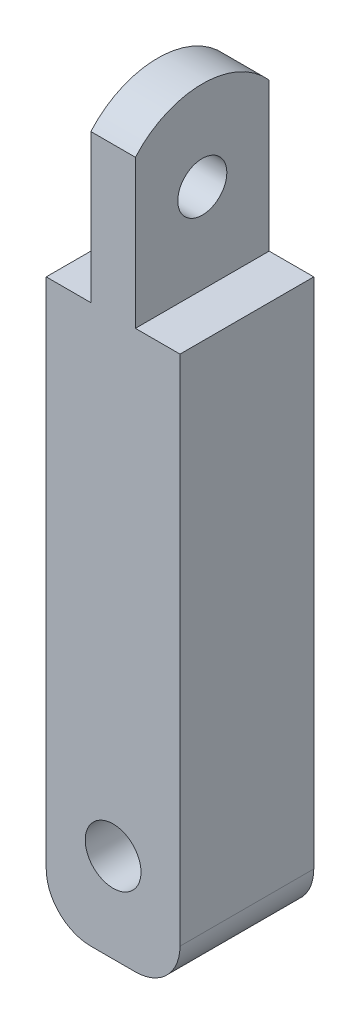
ISO-10303-21;
HEADER;
FILE_DESCRIPTION(('STEP AP214'),'2;1');
FILE_NAME('part.step','',(''),(''),'','','');
FILE_SCHEMA(('AUTOMOTIVE_DESIGN { 1 0 10303 214 1 1 1 1 }'));
ENDSEC;
DATA;
#1=APPLICATION_CONTEXT('core data for automotive mechanical design processes');
#2=APPLICATION_PROTOCOL_DEFINITION('international standard','automotive_design',2000,#1);
#3=PRODUCT_CONTEXT('',#1,'mechanical');
#4=PRODUCT('Part','Part','',(#3));
#5=PRODUCT_RELATED_PRODUCT_CATEGORY('part','',(#4));
#6=PRODUCT_DEFINITION_FORMATION('','',#4);
#7=PRODUCT_DEFINITION_CONTEXT('part definition',#1,'design');
#8=PRODUCT_DEFINITION('design','',#6,#7);
#9=PRODUCT_DEFINITION_SHAPE('','',#8);
#10=(LENGTH_UNIT() NAMED_UNIT(*) SI_UNIT(.MILLI.,.METRE.));
#11=(NAMED_UNIT(*) PLANE_ANGLE_UNIT() SI_UNIT($,.RADIAN.));
#12=(NAMED_UNIT(*) SI_UNIT($,.STERADIAN.) SOLID_ANGLE_UNIT());
#13=UNCERTAINTY_MEASURE_WITH_UNIT(LENGTH_MEASURE(1.E-05),#10,'distance_accuracy_value','');
#14=(GEOMETRIC_REPRESENTATION_CONTEXT(3) GLOBAL_UNCERTAINTY_ASSIGNED_CONTEXT((#13)) GLOBAL_UNIT_ASSIGNED_CONTEXT((#10,
#11,#12)) REPRESENTATION_CONTEXT('',''));
#15=CARTESIAN_POINT('',(0.,0.,0.));
#16=DIRECTION('',(0.,0.,1.));
#17=DIRECTION('',(1.,0.,0.));
#18=AXIS2_PLACEMENT_3D('',#15,#16,#17);
#19=CARTESIAN_POINT('',(1.,20.5,6.));
#20=DIRECTION('',(-1.,0.,0.));
#21=DIRECTION('',(0.,-1.,0.));
#22=AXIS2_PLACEMENT_3D('',#19,#20,#21);
#23=PLANE('',#22);
#24=CARTESIAN_POINT('',(1.,16.5,3.));
#25=DIRECTION('',(-1.,0.,0.));
#26=DIRECTION('',(0.,-1.,0.));
#27=AXIS2_PLACEMENT_3D('',#24,#25,#26);
#28=CIRCLE('',#27,1.1);
#29=CARTESIAN_POINT('',(1.,15.4,3.));
#30=VERTEX_POINT('',#29);
#31=EDGE_CURVE('E268',#30,#30,#28,.T.);
#32=ORIENTED_EDGE('',*,*,#31,.T.);
#33=EDGE_LOOP('',(#32));
#34=FACE_BOUND('',#33,.T.);
#35=DIRECTION('',(0.,1.,0.));
#36=VECTOR('',#35,1.);
#37=CARTESIAN_POINT('',(1.,20.5,0.));
#38=LINE('',#37,#36);
#39=CARTESIAN_POINT('',(1.,12.5,0.));
#40=VERTEX_POINT('',#39);
#41=CARTESIAN_POINT('',(1.,19.1457513110646,0.));
#42=VERTEX_POINT('',#41);
#43=EDGE_CURVE('E175',#40,#42,#38,.T.);
#44=ORIENTED_EDGE('',*,*,#43,.T.);
#45=CARTESIAN_POINT('',(1.,16.5,3.));
#46=DIRECTION('',(-1.,0.,0.));
#47=DIRECTION('',(0.,-1.,0.));
#48=AXIS2_PLACEMENT_3D('',#45,#46,#47);
#49=CIRCLE('',#48,4.);
#50=CARTESIAN_POINT('',(1.,19.1457513110646,6.));
#51=VERTEX_POINT('',#50);
#52=EDGE_CURVE('E159',#42,#51,#49,.F.);
#53=ORIENTED_EDGE('',*,*,#52,.T.);
#54=DIRECTION('',(0.,1.,0.));
#55=VECTOR('',#54,1.);
#56=CARTESIAN_POINT('',(1.,20.5,6.));
#57=LINE('',#56,#55);
#58=CARTESIAN_POINT('',(1.,12.5,6.));
#59=VERTEX_POINT('',#58);
#60=EDGE_CURVE('E248',#59,#51,#57,.T.);
#61=ORIENTED_EDGE('',*,*,#60,.F.);
#62=DIRECTION('',(0.,0.,-1.));
#63=VECTOR('',#62,1.);
#64=CARTESIAN_POINT('',(1.,12.5,6.));
#65=LINE('',#64,#63);
#66=EDGE_CURVE('E198',#59,#40,#65,.T.);
#67=ORIENTED_EDGE('',*,*,#66,.T.);
#68=EDGE_LOOP('',(#44,#53,#61,#67));
#69=FACE_BOUND('',#68,.T.);
#70=ADVANCED_FACE('F35',(#34,#69),#23,.F.);
#71=CARTESIAN_POINT('',(-1.,12.5,6.));
#72=DIRECTION('',(1.,0.,0.));
#73=DIRECTION('',(0.,1.,0.));
#74=AXIS2_PLACEMENT_3D('',#71,#72,#73);
#75=PLANE('',#74);
#76=CARTESIAN_POINT('',(-1.,16.5,3.));
#77=DIRECTION('',(-1.,0.,0.));
#78=DIRECTION('',(0.,-1.,0.));
#79=AXIS2_PLACEMENT_3D('',#76,#77,#78);
#80=CIRCLE('',#79,1.1);
#81=CARTESIAN_POINT('',(-1.,15.4,3.));
#82=VERTEX_POINT('',#81);
#83=EDGE_CURVE('E265',#82,#82,#80,.T.);
#84=ORIENTED_EDGE('',*,*,#83,.F.);
#85=EDGE_LOOP('',(#84));
#86=FACE_BOUND('',#85,.T.);
#87=CARTESIAN_POINT('',(-1.,16.5,3.));
#88=DIRECTION('',(-1.,0.,0.));
#89=DIRECTION('',(0.,0.,1.));
#90=AXIS2_PLACEMENT_3D('',#87,#88,#89);
#91=CIRCLE('',#90,4.);
#92=CARTESIAN_POINT('',(-1.,19.1457513110646,0.));
#93=VERTEX_POINT('',#92);
#94=CARTESIAN_POINT('',(-1.,19.1457513110646,6.));
#95=VERTEX_POINT('',#94);
#96=EDGE_CURVE('E149',#93,#95,#91,.F.);
#97=ORIENTED_EDGE('',*,*,#96,.F.);
#98=DIRECTION('',(0.,-1.,0.));
#99=VECTOR('',#98,1.);
#100=CARTESIAN_POINT('',(-1.,12.5,0.));
#101=LINE('',#100,#99);
#102=CARTESIAN_POINT('',(-1.,12.5,0.));
#103=VERTEX_POINT('',#102);
#104=EDGE_CURVE('E154',#93,#103,#101,.T.);
#105=ORIENTED_EDGE('',*,*,#104,.T.);
#106=DIRECTION('',(0.,0.,-1.));
#107=VECTOR('',#106,1.);
#108=CARTESIAN_POINT('',(-1.,12.5,6.));
#109=LINE('',#108,#107);
#110=CARTESIAN_POINT('',(-1.,12.5,6.));
#111=VERTEX_POINT('',#110);
#112=EDGE_CURVE('E196',#111,#103,#109,.T.);
#113=ORIENTED_EDGE('',*,*,#112,.F.);
#114=DIRECTION('',(0.,-1.,0.));
#115=VECTOR('',#114,1.);
#116=CARTESIAN_POINT('',(-1.,12.5,6.));
#117=LINE('',#116,#115);
#118=EDGE_CURVE('E156',#95,#111,#117,.T.);
#119=ORIENTED_EDGE('',*,*,#118,.F.);
#120=EDGE_LOOP('',(#97,#105,#113,#119));
#121=FACE_BOUND('',#120,.T.);
#122=ADVANCED_FACE('F151',(#86,#121),#75,.F.);
#123=CARTESIAN_POINT('',(0.,-8.5,0.));
#124=DIRECTION('',(0.,0.,1.));
#125=DIRECTION('',(1.,0.,0.));
#126=AXIS2_PLACEMENT_3D('',#123,#124,#125);
#127=CYLINDRICAL_SURFACE('',#126,1.25);
#128=CARTESIAN_POINT('',(0.,-8.5,6.));
#129=DIRECTION('',(0.,0.,1.));
#130=DIRECTION('',(1.,0.,0.));
#131=AXIS2_PLACEMENT_3D('',#128,#129,#130);
#132=CIRCLE('',#131,1.25);
#133=CARTESIAN_POINT('',(1.25,-8.5,6.));
#134=VERTEX_POINT('',#133);
#135=EDGE_CURVE('E204',#134,#134,#132,.T.);
#136=ORIENTED_EDGE('',*,*,#135,.T.);
#137=EDGE_LOOP('',(#136));
#138=FACE_BOUND('',#137,.T.);
#139=CARTESIAN_POINT('',(0.,-8.5,2.5));
#140=DIRECTION('',(0.,0.,-1.));
#141=DIRECTION('',(-1.,0.,0.));
#142=AXIS2_PLACEMENT_3D('',#139,#140,#141);
#143=CIRCLE('',#142,1.25);
#144=CARTESIAN_POINT('',(-1.25,-8.5,2.5));
#145=VERTEX_POINT('',#144);
#146=EDGE_CURVE('E201',#145,#145,#143,.F.);
#147=ORIENTED_EDGE('',*,*,#146,.F.);
#148=EDGE_LOOP('',(#147));
#149=FACE_BOUND('',#148,.T.);
#150=ADVANCED_FACE('F358',(#138,#149),#127,.F.);
#151=CARTESIAN_POINT('',(1.,12.5,6.));
#152=DIRECTION('',(0.,-1.,0.));
#153=DIRECTION('',(1.,0.,0.));
#154=AXIS2_PLACEMENT_3D('',#151,#152,#153);
#155=PLANE('',#154);
#156=DIRECTION('',(-1.,0.,0.));
#157=VECTOR('',#156,1.);
#158=CARTESIAN_POINT('',(1.,12.5,0.));
#159=LINE('',#158,#157);
#160=CARTESIAN_POINT('',(3.,12.5,0.));
#161=VERTEX_POINT('',#160);
#162=EDGE_CURVE('E179',#161,#40,#159,.T.);
#163=ORIENTED_EDGE('',*,*,#162,.T.);
#164=ORIENTED_EDGE('',*,*,#66,.F.);
#165=DIRECTION('',(-1.,0.,0.));
#166=VECTOR('',#165,1.);
#167=CARTESIAN_POINT('',(1.,12.5,6.));
#168=LINE('',#167,#166);
#169=CARTESIAN_POINT('',(3.,12.5,6.));
#170=VERTEX_POINT('',#169);
#171=EDGE_CURVE('E188',#170,#59,#168,.T.);
#172=ORIENTED_EDGE('',*,*,#171,.F.);
#173=DIRECTION('',(0.,0.,-1.));
#174=VECTOR('',#173,1.);
#175=CARTESIAN_POINT('',(3.,12.5,6.));
#176=LINE('',#175,#174);
#177=EDGE_CURVE('E189',#170,#161,#176,.T.);
#178=ORIENTED_EDGE('',*,*,#177,.T.);
#179=EDGE_LOOP('',(#163,#164,#172,#178));
#180=FACE_BOUND('',#179,.T.);
#181=ADVANCED_FACE('F363',(#180),#155,.F.);
#182=CARTESIAN_POINT('',(-3.,12.5,6.));
#183=DIRECTION('',(0.,-1.,0.));
#184=DIRECTION('',(1.,0.,0.));
#185=AXIS2_PLACEMENT_3D('',#182,#183,#184);
#186=PLANE('',#185);
#187=DIRECTION('',(-1.,0.,0.));
#188=VECTOR('',#187,1.);
#189=CARTESIAN_POINT('',(-3.,12.5,0.));
#190=LINE('',#189,#188);
#191=CARTESIAN_POINT('',(-3.,12.5,0.));
#192=VERTEX_POINT('',#191);
#193=EDGE_CURVE('E174',#103,#192,#190,.T.);
#194=ORIENTED_EDGE('',*,*,#193,.T.);
#195=DIRECTION('',(0.,0.,-1.));
#196=VECTOR('',#195,1.);
#197=CARTESIAN_POINT('',(-3.,12.5,6.));
#198=LINE('',#197,#196);
#199=CARTESIAN_POINT('',(-3.,12.5,6.));
#200=VERTEX_POINT('',#199);
#201=EDGE_CURVE('E192',#200,#192,#198,.T.);
#202=ORIENTED_EDGE('',*,*,#201,.F.);
#203=DIRECTION('',(-1.,0.,0.));
#204=VECTOR('',#203,1.);
#205=CARTESIAN_POINT('',(-3.,12.5,6.));
#206=LINE('',#205,#204);
#207=EDGE_CURVE('E245',#111,#200,#206,.T.);
#208=ORIENTED_EDGE('',*,*,#207,.F.);
#209=ORIENTED_EDGE('',*,*,#112,.T.);
#210=EDGE_LOOP('',(#194,#202,#208,#209));
#211=FACE_BOUND('',#210,.T.);
#212=ADVANCED_FACE('F244',(#211),#186,.F.);
#213=CARTESIAN_POINT('',(-3.,-12.5,6.));
#214=DIRECTION('',(1.,0.,0.));
#215=DIRECTION('',(0.,0.,-1.));
#216=AXIS2_PLACEMENT_3D('',#213,#214,#215);
#217=PLANE('',#216);
#218=DIRECTION('',(0.,-1.,0.));
#219=VECTOR('',#218,1.);
#220=CARTESIAN_POINT('',(-3.,-12.5,0.));
#221=LINE('',#220,#219);
#222=CARTESIAN_POINT('',(-3.,-10.5,0.));
#223=VERTEX_POINT('',#222);
#224=EDGE_CURVE('E177',#192,#223,#221,.T.);
#225=ORIENTED_EDGE('',*,*,#224,.T.);
#226=DIRECTION('',(0.,0.,-1.));
#227=VECTOR('',#226,1.);
#228=CARTESIAN_POINT('',(-3.,-10.5,6.));
#229=LINE('',#228,#227);
#230=CARTESIAN_POINT('',(-3.,-10.5,6.));
#231=VERTEX_POINT('',#230);
#232=EDGE_CURVE('E11',#223,#231,#229,.F.);
#233=ORIENTED_EDGE('',*,*,#232,.T.);
#234=DIRECTION('',(0.,-1.,0.));
#235=VECTOR('',#234,1.);
#236=CARTESIAN_POINT('',(-3.,-12.5,6.));
#237=LINE('',#236,#235);
#238=EDGE_CURVE('E241',#200,#231,#237,.T.);
#239=ORIENTED_EDGE('',*,*,#238,.F.);
#240=ORIENTED_EDGE('',*,*,#201,.T.);
#241=EDGE_LOOP('',(#225,#233,#239,#240));
#242=FACE_BOUND('',#241,.T.);
#243=ADVANCED_FACE('F239',(#242),#217,.F.);
#244=CARTESIAN_POINT('',(-3.,-12.5,6.));
#245=DIRECTION('',(0.,1.,0.));
#246=DIRECTION('',(0.,0.,1.));
#247=AXIS2_PLACEMENT_3D('',#244,#245,#246);
#248=PLANE('',#247);
#249=DIRECTION('',(1.,0.,0.));
#250=VECTOR('',#249,1.);
#251=CARTESIAN_POINT('',(-3.,-12.5,0.));
#252=LINE('',#251,#250);
#253=CARTESIAN_POINT('',(-1.,-12.5,0.));
#254=VERTEX_POINT('',#253);
#255=CARTESIAN_POINT('',(1.,-12.5,0.));
#256=VERTEX_POINT('',#255);
#257=EDGE_CURVE('E184',#254,#256,#252,.T.);
#258=ORIENTED_EDGE('',*,*,#257,.T.);
#259=DIRECTION('',(0.,0.,-1.));
#260=VECTOR('',#259,1.);
#261=CARTESIAN_POINT('',(1.,-12.5,6.));
#262=LINE('',#261,#260);
#263=CARTESIAN_POINT('',(1.,-12.5,6.));
#264=VERTEX_POINT('',#263);
#265=EDGE_CURVE('E56',#256,#264,#262,.F.);
#266=ORIENTED_EDGE('',*,*,#265,.T.);
#267=DIRECTION('',(1.,0.,0.));
#268=VECTOR('',#267,1.);
#269=CARTESIAN_POINT('',(-3.,-12.5,6.));
#270=LINE('',#269,#268);
#271=CARTESIAN_POINT('',(-1.,-12.5,6.));
#272=VERTEX_POINT('',#271);
#273=EDGE_CURVE('E225',#272,#264,#270,.T.);
#274=ORIENTED_EDGE('',*,*,#273,.F.);
#275=DIRECTION('',(0.,0.,-1.));
#276=VECTOR('',#275,1.);
#277=CARTESIAN_POINT('',(-1.,-12.5,6.));
#278=LINE('',#277,#276);
#279=EDGE_CURVE('E213',#272,#254,#278,.T.);
#280=ORIENTED_EDGE('',*,*,#279,.T.);
#281=EDGE_LOOP('',(#258,#266,#274,#280));
#282=FACE_BOUND('',#281,.T.);
#283=ADVANCED_FACE('F235',(#282),#248,.F.);
#284=CARTESIAN_POINT('',(3.,-12.5,6.));
#285=DIRECTION('',(-1.,0.,0.));
#286=DIRECTION('',(0.,0.,1.));
#287=AXIS2_PLACEMENT_3D('',#284,#285,#286);
#288=PLANE('',#287);
#289=DIRECTION('',(0.,1.,0.));
#290=VECTOR('',#289,1.);
#291=CARTESIAN_POINT('',(3.,-12.5,6.));
#292=LINE('',#291,#290);
#293=CARTESIAN_POINT('',(3.,-10.5,6.));
#294=VERTEX_POINT('',#293);
#295=EDGE_CURVE('E193',#294,#170,#292,.T.);
#296=ORIENTED_EDGE('',*,*,#295,.F.);
#297=DIRECTION('',(0.,0.,-1.));
#298=VECTOR('',#297,1.);
#299=CARTESIAN_POINT('',(3.,-10.5,6.));
#300=LINE('',#299,#298);
#301=CARTESIAN_POINT('',(3.,-10.5,0.));
#302=VERTEX_POINT('',#301);
#303=EDGE_CURVE('E167',#294,#302,#300,.T.);
#304=ORIENTED_EDGE('',*,*,#303,.T.);
#305=DIRECTION('',(0.,1.,0.));
#306=VECTOR('',#305,1.);
#307=CARTESIAN_POINT('',(3.,-12.5,0.));
#308=LINE('',#307,#306);
#309=EDGE_CURVE('E186',#302,#161,#308,.T.);
#310=ORIENTED_EDGE('',*,*,#309,.T.);
#311=ORIENTED_EDGE('',*,*,#177,.F.);
#312=EDGE_LOOP('',(#296,#304,#310,#311));
#313=FACE_BOUND('',#312,.T.);
#314=ADVANCED_FACE('F229',(#313),#288,.F.);
#315=CARTESIAN_POINT('',(0.,0.,6.));
#316=DIRECTION('',(0.,0.,1.));
#317=DIRECTION('',(1.,0.,0.));
#318=AXIS2_PLACEMENT_3D('',#315,#316,#317);
#319=PLANE('',#318);
#320=ORIENTED_EDGE('',*,*,#273,.T.);
#321=CARTESIAN_POINT('',(1.,-10.5,6.));
#322=DIRECTION('',(0.,0.,1.));
#323=DIRECTION('',(1.,0.,0.));
#324=AXIS2_PLACEMENT_3D('',#321,#322,#323);
#325=CIRCLE('',#324,2.);
#326=EDGE_CURVE('E43',#264,#294,#325,.T.);
#327=ORIENTED_EDGE('',*,*,#326,.T.);
#328=ORIENTED_EDGE('',*,*,#295,.T.);
#329=ORIENTED_EDGE('',*,*,#171,.T.);
#330=ORIENTED_EDGE('',*,*,#60,.T.);
#331=DIRECTION('',(-1.,0.,0.));
#332=VECTOR('',#331,1.);
#333=CARTESIAN_POINT('',(3.,19.1457513110646,6.));
#334=LINE('',#333,#332);
#335=EDGE_CURVE('E168',#95,#51,#334,.F.);
#336=ORIENTED_EDGE('',*,*,#335,.F.);
#337=ORIENTED_EDGE('',*,*,#118,.T.);
#338=ORIENTED_EDGE('',*,*,#207,.T.);
#339=ORIENTED_EDGE('',*,*,#238,.T.);
#340=CARTESIAN_POINT('',(-1.,-10.5,6.));
#341=DIRECTION('',(0.,0.,1.));
#342=DIRECTION('',(1.,0.,0.));
#343=AXIS2_PLACEMENT_3D('',#340,#341,#342);
#344=CIRCLE('',#343,2.);
#345=EDGE_CURVE('E217',#231,#272,#344,.T.);
#346=ORIENTED_EDGE('',*,*,#345,.T.);
#347=EDGE_LOOP('',(#320,#327,#328,#329,#330,#336,#337,#338,#339,#346));
#348=FACE_BOUND('',#347,.T.);
#349=ORIENTED_EDGE('',*,*,#135,.F.);
#350=EDGE_LOOP('',(#349));
#351=FACE_BOUND('',#350,.T.);
#352=ADVANCED_FACE('F221',(#348,#351),#319,.T.);
#353=CARTESIAN_POINT('',(0.,0.,0.));
#354=DIRECTION('',(0.,0.,1.));
#355=DIRECTION('',(1.,0.,0.));
#356=AXIS2_PLACEMENT_3D('',#353,#354,#355);
#357=PLANE('',#356);
#358=DIRECTION('',(0.866025403784439,-0.5,0.));
#359=VECTOR('',#358,1.);
#360=CARTESIAN_POINT('',(0.,-6.07512886940358,0.));
#361=LINE('',#360,#359);
#362=CARTESIAN_POINT('',(0.,-6.07512886940358,0.));
#363=VERTEX_POINT('',#362);
#364=CARTESIAN_POINT('',(2.1,-7.28756443470179,0.));
#365=VERTEX_POINT('',#364);
#366=EDGE_CURVE('E294',#363,#365,#361,.T.);
#367=ORIENTED_EDGE('',*,*,#366,.F.);
#368=DIRECTION('',(0.866025403784439,0.5,0.));
#369=VECTOR('',#368,1.);
#370=CARTESIAN_POINT('',(-2.1,-7.28756443470179,0.));
#371=LINE('',#370,#369);
#372=CARTESIAN_POINT('',(-2.1,-7.28756443470179,0.));
#373=VERTEX_POINT('',#372);
#374=EDGE_CURVE('E273',#373,#363,#371,.T.);
#375=ORIENTED_EDGE('',*,*,#374,.F.);
#376=DIRECTION('',(0.,1.,0.));
#377=VECTOR('',#376,1.);
#378=CARTESIAN_POINT('',(-2.1,-9.71243556529822,0.));
#379=LINE('',#378,#377);
#380=CARTESIAN_POINT('',(-2.1,-9.71243556529822,0.));
#381=VERTEX_POINT('',#380);
#382=EDGE_CURVE('E278',#381,#373,#379,.T.);
#383=ORIENTED_EDGE('',*,*,#382,.F.);
#384=DIRECTION('',(-0.866025403784439,0.5,0.));
#385=VECTOR('',#384,1.);
#386=CARTESIAN_POINT('',(0.,-10.9248711305964,0.));
#387=LINE('',#386,#385);
#388=CARTESIAN_POINT('',(0.,-10.9248711305964,0.));
#389=VERTEX_POINT('',#388);
#390=EDGE_CURVE('E303',#389,#381,#387,.T.);
#391=ORIENTED_EDGE('',*,*,#390,.F.);
#392=DIRECTION('',(-0.866025403784438,-0.5,0.));
#393=VECTOR('',#392,1.);
#394=CARTESIAN_POINT('',(2.1,-9.71243556529821,0.));
#395=LINE('',#394,#393);
#396=CARTESIAN_POINT('',(2.1,-9.71243556529821,0.));
#397=VERTEX_POINT('',#396);
#398=EDGE_CURVE('E300',#397,#389,#395,.T.);
#399=ORIENTED_EDGE('',*,*,#398,.F.);
#400=DIRECTION('',(0.,-1.,0.));
#401=VECTOR('',#400,1.);
#402=CARTESIAN_POINT('',(2.1,-7.28756443470179,0.));
#403=LINE('',#402,#401);
#404=EDGE_CURVE('E297',#365,#397,#403,.T.);
#405=ORIENTED_EDGE('',*,*,#404,.F.);
#406=EDGE_LOOP('',(#367,#375,#383,#391,#399,#405));
#407=FACE_BOUND('',#406,.T.);
#408=ORIENTED_EDGE('',*,*,#309,.F.);
#409=CARTESIAN_POINT('',(1.,-10.5,0.));
#410=DIRECTION('',(0.,0.,1.));
#411=DIRECTION('',(1.,0.,0.));
#412=AXIS2_PLACEMENT_3D('',#409,#410,#411);
#413=CIRCLE('',#412,2.);
#414=EDGE_CURVE('E211',#302,#256,#413,.F.);
#415=ORIENTED_EDGE('',*,*,#414,.T.);
#416=ORIENTED_EDGE('',*,*,#257,.F.);
#417=CARTESIAN_POINT('',(-1.,-10.5,0.));
#418=DIRECTION('',(0.,0.,1.));
#419=DIRECTION('',(1.,0.,0.));
#420=AXIS2_PLACEMENT_3D('',#417,#418,#419);
#421=CIRCLE('',#420,2.);
#422=EDGE_CURVE('E209',#254,#223,#421,.F.);
#423=ORIENTED_EDGE('',*,*,#422,.T.);
#424=ORIENTED_EDGE('',*,*,#224,.F.);
#425=ORIENTED_EDGE('',*,*,#193,.F.);
#426=ORIENTED_EDGE('',*,*,#104,.F.);
#427=DIRECTION('',(-1.,0.,0.));
#428=VECTOR('',#427,1.);
#429=CARTESIAN_POINT('',(3.,19.1457513110646,0.));
#430=LINE('',#429,#428);
#431=EDGE_CURVE('E162',#93,#42,#430,.F.);
#432=ORIENTED_EDGE('',*,*,#431,.T.);
#433=ORIENTED_EDGE('',*,*,#43,.F.);
#434=ORIENTED_EDGE('',*,*,#162,.F.);
#435=EDGE_LOOP('',(#408,#415,#416,#423,#424,#425,#426,#432,#433,#434));
#436=FACE_BOUND('',#435,.T.);
#437=ADVANCED_FACE('F172',(#407,#436),#357,.F.);
#438=CARTESIAN_POINT('',(0.,0.,2.5));
#439=DIRECTION('',(0.,0.,-1.));
#440=DIRECTION('',(-1.,0.,0.));
#441=AXIS2_PLACEMENT_3D('',#438,#439,#440);
#442=PLANE('',#441);
#443=DIRECTION('',(0.866025403784439,0.5,0.));
#444=VECTOR('',#443,1.);
#445=CARTESIAN_POINT('',(-2.1,-7.28756443470179,2.5));
#446=LINE('',#445,#444);
#447=CARTESIAN_POINT('',(-2.1,-7.28756443470179,2.5));
#448=VERTEX_POINT('',#447);
#449=CARTESIAN_POINT('',(0.,-6.07512886940358,2.5));
#450=VERTEX_POINT('',#449);
#451=EDGE_CURVE('E274',#448,#450,#446,.T.);
#452=ORIENTED_EDGE('',*,*,#451,.T.);
#453=DIRECTION('',(0.866025403784439,-0.5,0.));
#454=VECTOR('',#453,1.);
#455=CARTESIAN_POINT('',(0.,-6.07512886940358,2.5));
#456=LINE('',#455,#454);
#457=CARTESIAN_POINT('',(2.1,-7.28756443470179,2.5));
#458=VERTEX_POINT('',#457);
#459=EDGE_CURVE('E277',#450,#458,#456,.T.);
#460=ORIENTED_EDGE('',*,*,#459,.T.);
#461=DIRECTION('',(0.,-1.,0.));
#462=VECTOR('',#461,1.);
#463=CARTESIAN_POINT('',(2.1,-7.28756443470179,2.5));
#464=LINE('',#463,#462);
#465=CARTESIAN_POINT('',(2.1,-9.71243556529821,2.5));
#466=VERTEX_POINT('',#465);
#467=EDGE_CURVE('E281',#458,#466,#464,.T.);
#468=ORIENTED_EDGE('',*,*,#467,.T.);
#469=DIRECTION('',(-0.866025403784438,-0.5,0.));
#470=VECTOR('',#469,1.);
#471=CARTESIAN_POINT('',(2.1,-9.71243556529821,2.5));
#472=LINE('',#471,#470);
#473=CARTESIAN_POINT('',(0.,-10.9248711305964,2.5));
#474=VERTEX_POINT('',#473);
#475=EDGE_CURVE('E284',#466,#474,#472,.T.);
#476=ORIENTED_EDGE('',*,*,#475,.T.);
#477=DIRECTION('',(-0.866025403784439,0.5,0.));
#478=VECTOR('',#477,1.);
#479=CARTESIAN_POINT('',(0.,-10.9248711305964,2.5));
#480=LINE('',#479,#478);
#481=CARTESIAN_POINT('',(-2.1,-9.71243556529822,2.5));
#482=VERTEX_POINT('',#481);
#483=EDGE_CURVE('E287',#474,#482,#480,.T.);
#484=ORIENTED_EDGE('',*,*,#483,.T.);
#485=DIRECTION('',(0.,1.,0.));
#486=VECTOR('',#485,1.);
#487=CARTESIAN_POINT('',(-2.1,-9.71243556529822,2.5));
#488=LINE('',#487,#486);
#489=EDGE_CURVE('E290',#482,#448,#488,.T.);
#490=ORIENTED_EDGE('',*,*,#489,.T.);
#491=EDGE_LOOP('',(#452,#460,#468,#476,#484,#490));
#492=FACE_BOUND('',#491,.T.);
#493=ORIENTED_EDGE('',*,*,#146,.T.);
#494=EDGE_LOOP('',(#493));
#495=FACE_BOUND('',#494,.T.);
#496=ADVANCED_FACE('F336',(#492,#495),#442,.T.);
#497=CARTESIAN_POINT('',(-2.1,-7.28756443470179,2.5));
#498=DIRECTION('',(-0.5,0.866025403784439,0.));
#499=DIRECTION('',(-0.866025403784439,-0.5,0.));
#500=AXIS2_PLACEMENT_3D('',#497,#498,#499);
#501=PLANE('',#500);
#502=ORIENTED_EDGE('',*,*,#374,.T.);
#503=DIRECTION('',(0.,0.,-1.));
#504=VECTOR('',#503,1.);
#505=CARTESIAN_POINT('',(0.,-6.07512886940358,2.5));
#506=LINE('',#505,#504);
#507=EDGE_CURVE('E261',#450,#363,#506,.T.);
#508=ORIENTED_EDGE('',*,*,#507,.F.);
#509=ORIENTED_EDGE('',*,*,#451,.F.);
#510=DIRECTION('',(0.,0.,-1.));
#511=VECTOR('',#510,1.);
#512=CARTESIAN_POINT('',(-2.1,-7.28756443470179,2.5));
#513=LINE('',#512,#511);
#514=EDGE_CURVE('E205',#448,#373,#513,.T.);
#515=ORIENTED_EDGE('',*,*,#514,.T.);
#516=EDGE_LOOP('',(#502,#508,#509,#515));
#517=FACE_BOUND('',#516,.T.);
#518=ADVANCED_FACE('F339',(#517),#501,.F.);
#519=CARTESIAN_POINT('',(-2.1,-9.71243556529822,2.5));
#520=DIRECTION('',(-1.,0.,0.));
#521=DIRECTION('',(0.,-1.,0.));
#522=AXIS2_PLACEMENT_3D('',#519,#520,#521);
#523=PLANE('',#522);
#524=ORIENTED_EDGE('',*,*,#382,.T.);
#525=ORIENTED_EDGE('',*,*,#514,.F.);
#526=ORIENTED_EDGE('',*,*,#489,.F.);
#527=DIRECTION('',(0.,0.,-1.));
#528=VECTOR('',#527,1.);
#529=CARTESIAN_POINT('',(-2.1,-9.71243556529822,2.5));
#530=LINE('',#529,#528);
#531=EDGE_CURVE('E309',#482,#381,#530,.T.);
#532=ORIENTED_EDGE('',*,*,#531,.T.);
#533=EDGE_LOOP('',(#524,#525,#526,#532));
#534=FACE_BOUND('',#533,.T.);
#535=ADVANCED_FACE('F341',(#534),#523,.F.);
#536=CARTESIAN_POINT('',(0.,-10.9248711305964,2.5));
#537=DIRECTION('',(-0.5,-0.866025403784439,0.));
#538=DIRECTION('',(0.866025403784439,-0.5,0.));
#539=AXIS2_PLACEMENT_3D('',#536,#537,#538);
#540=PLANE('',#539);
#541=ORIENTED_EDGE('',*,*,#390,.T.);
#542=ORIENTED_EDGE('',*,*,#531,.F.);
#543=ORIENTED_EDGE('',*,*,#483,.F.);
#544=DIRECTION('',(0.,0.,-1.));
#545=VECTOR('',#544,1.);
#546=CARTESIAN_POINT('',(0.,-10.9248711305964,2.5));
#547=LINE('',#546,#545);
#548=EDGE_CURVE('E311',#474,#389,#547,.T.);
#549=ORIENTED_EDGE('',*,*,#548,.T.);
#550=EDGE_LOOP('',(#541,#542,#543,#549));
#551=FACE_BOUND('',#550,.T.);
#552=ADVANCED_FACE('F343',(#551),#540,.F.);
#553=CARTESIAN_POINT('',(2.1,-9.71243556529821,2.5));
#554=DIRECTION('',(0.5,-0.866025403784438,0.));
#555=DIRECTION('',(0.866025403784439,0.5,0.));
#556=AXIS2_PLACEMENT_3D('',#553,#554,#555);
#557=PLANE('',#556);
#558=ORIENTED_EDGE('',*,*,#398,.T.);
#559=ORIENTED_EDGE('',*,*,#548,.F.);
#560=ORIENTED_EDGE('',*,*,#475,.F.);
#561=DIRECTION('',(0.,0.,-1.));
#562=VECTOR('',#561,1.);
#563=CARTESIAN_POINT('',(2.1,-9.71243556529821,2.5));
#564=LINE('',#563,#562);
#565=EDGE_CURVE('E313',#466,#397,#564,.T.);
#566=ORIENTED_EDGE('',*,*,#565,.T.);
#567=EDGE_LOOP('',(#558,#559,#560,#566));
#568=FACE_BOUND('',#567,.T.);
#569=ADVANCED_FACE('F333',(#568),#557,.F.);
#570=CARTESIAN_POINT('',(2.1,-7.28756443470179,2.5));
#571=DIRECTION('',(1.,0.,0.));
#572=DIRECTION('',(0.,0.,-1.));
#573=AXIS2_PLACEMENT_3D('',#570,#571,#572);
#574=PLANE('',#573);
#575=ORIENTED_EDGE('',*,*,#404,.T.);
#576=ORIENTED_EDGE('',*,*,#565,.F.);
#577=ORIENTED_EDGE('',*,*,#467,.F.);
#578=DIRECTION('',(0.,0.,-1.));
#579=VECTOR('',#578,1.);
#580=CARTESIAN_POINT('',(2.1,-7.28756443470179,2.5));
#581=LINE('',#580,#579);
#582=EDGE_CURVE('E314',#458,#365,#581,.T.);
#583=ORIENTED_EDGE('',*,*,#582,.T.);
#584=EDGE_LOOP('',(#575,#576,#577,#583));
#585=FACE_BOUND('',#584,.T.);
#586=ADVANCED_FACE('F330',(#585),#574,.F.);
#587=CARTESIAN_POINT('',(0.,-6.07512886940358,2.5));
#588=DIRECTION('',(0.5,0.866025403784438,0.));
#589=DIRECTION('',(-0.866025403784439,0.5,0.));
#590=AXIS2_PLACEMENT_3D('',#587,#588,#589);
#591=PLANE('',#590);
#592=ORIENTED_EDGE('',*,*,#366,.T.);
#593=ORIENTED_EDGE('',*,*,#582,.F.);
#594=ORIENTED_EDGE('',*,*,#459,.F.);
#595=ORIENTED_EDGE('',*,*,#507,.T.);
#596=EDGE_LOOP('',(#592,#593,#594,#595));
#597=FACE_BOUND('',#596,.T.);
#598=ADVANCED_FACE('F321',(#597),#591,.F.);
#599=CARTESIAN_POINT('',(3.,16.5,3.));
#600=DIRECTION('',(-1.,0.,0.));
#601=DIRECTION('',(0.,-1.,0.));
#602=AXIS2_PLACEMENT_3D('',#599,#600,#601);
#603=CYLINDRICAL_SURFACE('',#602,1.1);
#604=ORIENTED_EDGE('',*,*,#83,.T.);
#605=EDGE_LOOP('',(#604));
#606=FACE_BOUND('',#605,.T.);
#607=ORIENTED_EDGE('',*,*,#31,.F.);
#608=EDGE_LOOP('',(#607));
#609=FACE_BOUND('',#608,.T.);
#610=ADVANCED_FACE('F370',(#606,#609),#603,.F.);
#611=CARTESIAN_POINT('',(3.,16.5,3.));
#612=DIRECTION('',(-1.,0.,0.));
#613=DIRECTION('',(0.,0.,1.));
#614=AXIS2_PLACEMENT_3D('',#611,#612,#613);
#615=CYLINDRICAL_SURFACE('',#614,4.);
#616=ORIENTED_EDGE('',*,*,#52,.F.);
#617=ORIENTED_EDGE('',*,*,#431,.F.);
#618=ORIENTED_EDGE('',*,*,#96,.T.);
#619=ORIENTED_EDGE('',*,*,#335,.T.);
#620=EDGE_LOOP('',(#616,#617,#618,#619));
#621=FACE_BOUND('',#620,.T.);
#622=ADVANCED_FACE('F163',(#621),#615,.T.);
#623=CARTESIAN_POINT('',(1.,-10.5,6.));
#624=DIRECTION('',(0.,0.,-1.));
#625=DIRECTION('',(-1.,0.,0.));
#626=AXIS2_PLACEMENT_3D('',#623,#624,#625);
#627=CYLINDRICAL_SURFACE('',#626,2.);
#628=ORIENTED_EDGE('',*,*,#326,.F.);
#629=ORIENTED_EDGE('',*,*,#265,.F.);
#630=ORIENTED_EDGE('',*,*,#414,.F.);
#631=ORIENTED_EDGE('',*,*,#303,.F.);
#632=EDGE_LOOP('',(#628,#629,#630,#631));
#633=FACE_BOUND('',#632,.T.);
#634=ADVANCED_FACE('F232',(#633),#627,.T.);
#635=CARTESIAN_POINT('',(-1.,-10.5,6.));
#636=DIRECTION('',(0.,0.,-1.));
#637=DIRECTION('',(-1.,0.,0.));
#638=AXIS2_PLACEMENT_3D('',#635,#636,#637);
#639=CYLINDRICAL_SURFACE('',#638,2.);
#640=ORIENTED_EDGE('',*,*,#345,.F.);
#641=ORIENTED_EDGE('',*,*,#232,.F.);
#642=ORIENTED_EDGE('',*,*,#422,.F.);
#643=ORIENTED_EDGE('',*,*,#279,.F.);
#644=EDGE_LOOP('',(#640,#641,#642,#643));
#645=FACE_BOUND('',#644,.T.);
#646=ADVANCED_FACE('F37',(#645),#639,.T.);
#647=CLOSED_SHELL('',(#70,#122,#150,#181,#212,#243,#283,#314,#352,#437,#496,#518,#535,#552,#569,
#586,#598,#610,#622,#634,#646));
#648=MANIFOLD_SOLID_BREP('B2',#647);
#649=ADVANCED_BREP_SHAPE_REPRESENTATION('',(#18,#648),#14);
#650=SHAPE_DEFINITION_REPRESENTATION(#9,#649);
ENDSEC;
END-ISO-10303-21;
